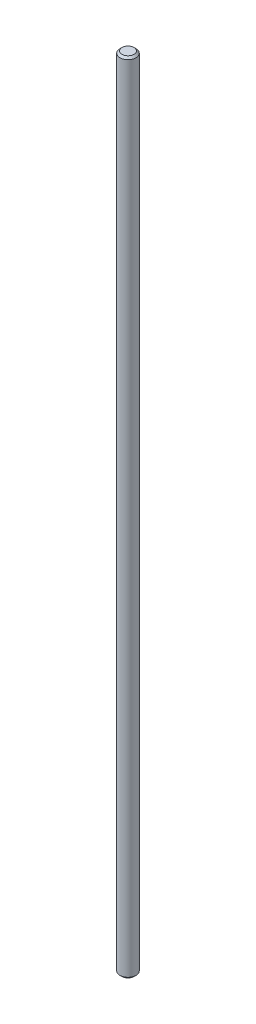
ISO-10303-21;
HEADER;
FILE_DESCRIPTION(('STEP AP214'),'2;1');
FILE_NAME('part.step','',(''),(''),'','','');
FILE_SCHEMA(('AUTOMOTIVE_DESIGN { 1 0 10303 214 1 1 1 1 }'));
ENDSEC;
DATA;
#1=APPLICATION_CONTEXT('core data for automotive mechanical design processes');
#2=APPLICATION_PROTOCOL_DEFINITION('international standard','automotive_design',2000,#1);
#3=PRODUCT_CONTEXT('',#1,'mechanical');
#4=PRODUCT('Part','Part','',(#3));
#5=PRODUCT_RELATED_PRODUCT_CATEGORY('part','',(#4));
#6=PRODUCT_DEFINITION_FORMATION('','',#4);
#7=PRODUCT_DEFINITION_CONTEXT('part definition',#1,'design');
#8=PRODUCT_DEFINITION('design','',#6,#7);
#9=PRODUCT_DEFINITION_SHAPE('','',#8);
#10=(LENGTH_UNIT() NAMED_UNIT(*) SI_UNIT(.MILLI.,.METRE.));
#11=(NAMED_UNIT(*) PLANE_ANGLE_UNIT() SI_UNIT($,.RADIAN.));
#12=(NAMED_UNIT(*) SI_UNIT($,.STERADIAN.) SOLID_ANGLE_UNIT());
#13=UNCERTAINTY_MEASURE_WITH_UNIT(LENGTH_MEASURE(1.E-05),#10,'distance_accuracy_value','');
#14=(GEOMETRIC_REPRESENTATION_CONTEXT(3) GLOBAL_UNCERTAINTY_ASSIGNED_CONTEXT((#13)) GLOBAL_UNIT_ASSIGNED_CONTEXT((#10,
#11,#12)) REPRESENTATION_CONTEXT('',''));
#15=CARTESIAN_POINT('',(0.,0.,0.));
#16=DIRECTION('',(0.,0.,1.));
#17=DIRECTION('',(1.,0.,0.));
#18=AXIS2_PLACEMENT_3D('',#15,#16,#17);
#19=CARTESIAN_POINT('',(0.,200.,0.));
#20=DIRECTION('',(0.,-1.,0.));
#21=DIRECTION('',(0.,0.,-1.));
#22=AXIS2_PLACEMENT_3D('',#19,#20,#21);
#23=CYLINDRICAL_SURFACE('',#22,4.);
#24=CARTESIAN_POINT('',(0.,-199.,0.));
#25=DIRECTION('',(0.,1.,0.));
#26=DIRECTION('',(0.,0.,1.));
#27=AXIS2_PLACEMENT_3D('',#24,#25,#26);
#28=CIRCLE('',#27,4.);
#29=CARTESIAN_POINT('',(0.,-199.,4.));
#30=VERTEX_POINT('',#29);
#31=EDGE_CURVE('E41',#30,#30,#28,.T.);
#32=ORIENTED_EDGE('',*,*,#31,.T.);
#33=EDGE_LOOP('',(#32));
#34=FACE_BOUND('',#33,.T.);
#35=CARTESIAN_POINT('',(0.,199.,0.));
#36=DIRECTION('',(0.,1.,0.));
#37=DIRECTION('',(0.,0.,1.));
#38=AXIS2_PLACEMENT_3D('',#35,#36,#37);
#39=CIRCLE('',#38,4.);
#40=CARTESIAN_POINT('',(0.,199.,4.));
#41=VERTEX_POINT('',#40);
#42=EDGE_CURVE('E45',#41,#41,#39,.F.);
#43=ORIENTED_EDGE('',*,*,#42,.T.);
#44=EDGE_LOOP('',(#43));
#45=FACE_BOUND('',#44,.T.);
#46=ADVANCED_FACE('F30',(#34,#45),#23,.T.);
#47=CARTESIAN_POINT('',(0.,200.,0.));
#48=DIRECTION('',(0.,1.,0.));
#49=DIRECTION('',(0.,0.,1.));
#50=AXIS2_PLACEMENT_3D('',#47,#48,#49);
#51=PLANE('',#50);
#52=CARTESIAN_POINT('',(0.,200.,0.));
#53=DIRECTION('',(0.,1.,0.));
#54=DIRECTION('',(0.,0.,1.));
#55=AXIS2_PLACEMENT_3D('',#52,#53,#54);
#56=CIRCLE('',#55,3.);
#57=CARTESIAN_POINT('',(0.,200.,3.));
#58=VERTEX_POINT('',#57);
#59=EDGE_CURVE('E10',#58,#58,#56,.T.);
#60=ORIENTED_EDGE('',*,*,#59,.T.);
#61=EDGE_LOOP('',(#60));
#62=FACE_BOUND('',#61,.T.);
#63=ADVANCED_FACE('F61',(#62),#51,.T.);
#64=CARTESIAN_POINT('',(0.,-200.,0.));
#65=DIRECTION('',(0.,1.,0.));
#66=DIRECTION('',(0.,0.,1.));
#67=AXIS2_PLACEMENT_3D('',#64,#65,#66);
#68=PLANE('',#67);
#69=CARTESIAN_POINT('',(0.,-200.,0.));
#70=DIRECTION('',(0.,1.,0.));
#71=DIRECTION('',(0.,0.,1.));
#72=AXIS2_PLACEMENT_3D('',#69,#70,#71);
#73=CIRCLE('',#72,2.99999999999989);
#74=CARTESIAN_POINT('',(0.,-200.,2.99999999999989));
#75=VERTEX_POINT('',#74);
#76=EDGE_CURVE('E37',#75,#75,#73,.F.);
#77=ORIENTED_EDGE('',*,*,#76,.T.);
#78=EDGE_LOOP('',(#77));
#79=FACE_BOUND('',#78,.T.);
#80=ADVANCED_FACE('F58',(#79),#68,.F.);
#81=CARTESIAN_POINT('',(0.,-199.,0.));
#82=DIRECTION('',(0.,1.,0.));
#83=DIRECTION('',(0.,0.,1.));
#84=AXIS2_PLACEMENT_3D('',#81,#82,#83);
#85=CONICAL_SURFACE('',#84,4.,0.785398163397474);
#86=ORIENTED_EDGE('',*,*,#76,.F.);
#87=EDGE_LOOP('',(#86));
#88=FACE_BOUND('',#87,.T.);
#89=ORIENTED_EDGE('',*,*,#31,.F.);
#90=EDGE_LOOP('',(#89));
#91=FACE_BOUND('',#90,.T.);
#92=ADVANCED_FACE('F54',(#88,#91),#85,.T.);
#93=CARTESIAN_POINT('',(0.,200.,0.));
#94=DIRECTION('',(0.,-1.,0.));
#95=DIRECTION('',(0.,0.,-1.));
#96=AXIS2_PLACEMENT_3D('',#93,#94,#95);
#97=CONICAL_SURFACE('',#96,3.,0.785398163397447);
#98=ORIENTED_EDGE('',*,*,#42,.F.);
#99=EDGE_LOOP('',(#98));
#100=FACE_BOUND('',#99,.T.);
#101=ORIENTED_EDGE('',*,*,#59,.F.);
#102=EDGE_LOOP('',(#101));
#103=FACE_BOUND('',#102,.T.);
#104=ADVANCED_FACE('F32',(#100,#103),#97,.T.);
#105=CLOSED_SHELL('',(#46,#63,#80,#92,#104));
#106=MANIFOLD_SOLID_BREP('B2',#105);
#107=ADVANCED_BREP_SHAPE_REPRESENTATION('',(#18,#106),#14);
#108=SHAPE_DEFINITION_REPRESENTATION(#9,#107);
ENDSEC;
END-ISO-10303-21;
